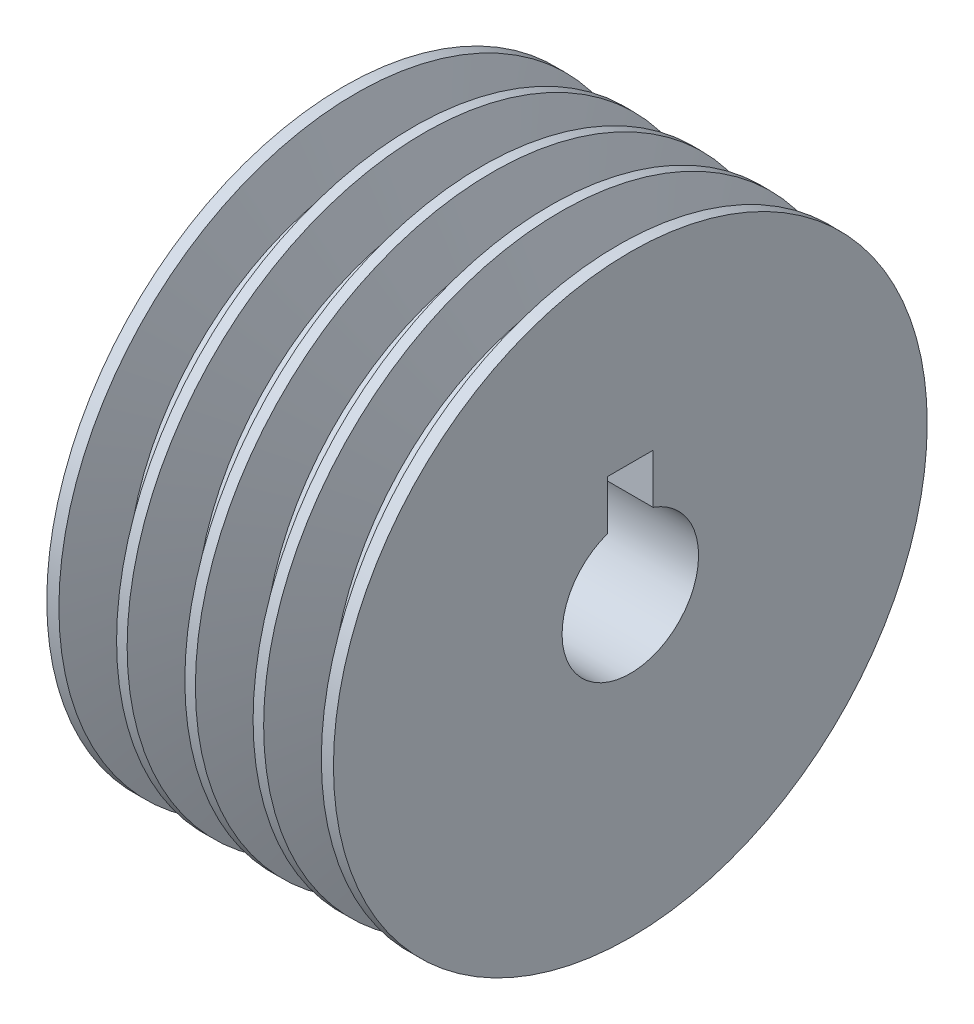
ISO-10303-21;
HEADER;
FILE_DESCRIPTION(('STEP AP214'),'2;1');
FILE_NAME('part.step','',(''),(''),'','','');
FILE_SCHEMA(('AUTOMOTIVE_DESIGN { 1 0 10303 214 1 1 1 1 }'));
ENDSEC;
DATA;
#1=APPLICATION_CONTEXT('core data for automotive mechanical design processes');
#2=APPLICATION_PROTOCOL_DEFINITION('international standard','automotive_design',2000,#1);
#3=PRODUCT_CONTEXT('',#1,'mechanical');
#4=PRODUCT('Part','Part','',(#3));
#5=PRODUCT_RELATED_PRODUCT_CATEGORY('part','',(#4));
#6=PRODUCT_DEFINITION_FORMATION('','',#4);
#7=PRODUCT_DEFINITION_CONTEXT('part definition',#1,'design');
#8=PRODUCT_DEFINITION('design','',#6,#7);
#9=PRODUCT_DEFINITION_SHAPE('','',#8);
#10=(LENGTH_UNIT() NAMED_UNIT(*) SI_UNIT(.MILLI.,.METRE.));
#11=(NAMED_UNIT(*) PLANE_ANGLE_UNIT() SI_UNIT($,.RADIAN.));
#12=(NAMED_UNIT(*) SI_UNIT($,.STERADIAN.) SOLID_ANGLE_UNIT());
#13=UNCERTAINTY_MEASURE_WITH_UNIT(LENGTH_MEASURE(1.E-05),#10,'distance_accuracy_value','');
#14=(GEOMETRIC_REPRESENTATION_CONTEXT(3) GLOBAL_UNCERTAINTY_ASSIGNED_CONTEXT((#13)) GLOBAL_UNIT_ASSIGNED_CONTEXT((#10,
#11,#12)) REPRESENTATION_CONTEXT('',''));
#15=CARTESIAN_POINT('',(0.,0.,0.));
#16=DIRECTION('',(0.,0.,1.));
#17=DIRECTION('',(1.,0.,0.));
#18=AXIS2_PLACEMENT_3D('',#15,#16,#17);
#19=CARTESIAN_POINT('',(31.5,0.,0.));
#20=DIRECTION('',(-1.,0.,0.));
#21=DIRECTION('',(0.,0.,1.));
#22=AXIS2_PLACEMENT_3D('',#19,#20,#21);
#23=CYLINDRICAL_SURFACE('',#22,65.25);
#24=CARTESIAN_POINT('',(13.8407593740113,0.,0.));
#25=DIRECTION('',(-1.,0.,0.));
#26=DIRECTION('',(0.,0.,1.));
#27=AXIS2_PLACEMENT_3D('',#24,#25,#26);
#28=CIRCLE('',#27,65.25);
#29=CARTESIAN_POINT('',(13.8407593740113,0.,65.25));
#30=VERTEX_POINT('',#29);
#31=EDGE_CURVE('E236',#30,#30,#28,.T.);
#32=ORIENTED_EDGE('',*,*,#31,.F.);
#33=EDGE_LOOP('',(#32));
#34=FACE_BOUND('',#33,.T.);
#35=CARTESIAN_POINT('',(16.1592406259887,0.,0.));
#36=DIRECTION('',(-1.,0.,0.));
#37=DIRECTION('',(0.,0.,1.));
#38=AXIS2_PLACEMENT_3D('',#35,#36,#37);
#39=CIRCLE('',#38,65.25);
#40=CARTESIAN_POINT('',(16.1592406259887,0.,65.25));
#41=VERTEX_POINT('',#40);
#42=EDGE_CURVE('E230',#41,#41,#39,.T.);
#43=ORIENTED_EDGE('',*,*,#42,.T.);
#44=EDGE_LOOP('',(#43));
#45=FACE_BOUND('',#44,.T.);
#46=ADVANCED_FACE('F34',(#34,#45),#23,.T.);
#47=CARTESIAN_POINT('',(31.5,0.,0.));
#48=DIRECTION('',(1.,0.,0.));
#49=DIRECTION('',(0.,0.,-1.));
#50=AXIS2_PLACEMENT_3D('',#47,#48,#49);
#51=CIRCLE('',#50,65.25);
#52=CARTESIAN_POINT('',(31.5,0.,-65.25));
#53=VERTEX_POINT('',#52);
#54=EDGE_CURVE('E11',#53,#53,#51,.T.);
#55=ORIENTED_EDGE('',*,*,#54,.F.);
#56=EDGE_LOOP('',(#55));
#57=FACE_BOUND('',#56,.T.);
#58=CARTESIAN_POINT('',(28.8407593740113,0.,0.));
#59=DIRECTION('',(-1.,0.,0.));
#60=DIRECTION('',(0.,0.,1.));
#61=AXIS2_PLACEMENT_3D('',#58,#59,#60);
#62=CIRCLE('',#61,65.25);
#63=CARTESIAN_POINT('',(28.8407593740113,0.,65.25));
#64=VERTEX_POINT('',#63);
#65=EDGE_CURVE('E221',#64,#64,#62,.T.);
#66=ORIENTED_EDGE('',*,*,#65,.F.);
#67=EDGE_LOOP('',(#66));
#68=FACE_BOUND('',#67,.T.);
#69=ADVANCED_FACE('F130',(#57,#68),#23,.T.);
#70=CARTESIAN_POINT('',(-1.15924062598866,0.,0.));
#71=DIRECTION('',(-1.,0.,0.));
#72=DIRECTION('',(0.,0.,1.));
#73=AXIS2_PLACEMENT_3D('',#70,#71,#72);
#74=CIRCLE('',#73,65.25);
#75=CARTESIAN_POINT('',(-1.15924062598866,0.,65.25));
#76=VERTEX_POINT('',#75);
#77=EDGE_CURVE('E248',#76,#76,#74,.T.);
#78=ORIENTED_EDGE('',*,*,#77,.F.);
#79=EDGE_LOOP('',(#78));
#80=FACE_BOUND('',#79,.T.);
#81=CARTESIAN_POINT('',(1.15924062598871,0.,0.));
#82=DIRECTION('',(-1.,0.,0.));
#83=DIRECTION('',(0.,0.,1.));
#84=AXIS2_PLACEMENT_3D('',#81,#82,#83);
#85=CIRCLE('',#84,65.25);
#86=CARTESIAN_POINT('',(1.15924062598871,0.,65.25));
#87=VERTEX_POINT('',#86);
#88=EDGE_CURVE('E228',#87,#87,#85,.T.);
#89=ORIENTED_EDGE('',*,*,#88,.T.);
#90=EDGE_LOOP('',(#89));
#91=FACE_BOUND('',#90,.T.);
#92=ADVANCED_FACE('F135',(#80,#91),#23,.T.);
#93=CARTESIAN_POINT('',(-16.1592406259887,0.,0.));
#94=DIRECTION('',(-1.,0.,0.));
#95=DIRECTION('',(0.,0.,1.));
#96=AXIS2_PLACEMENT_3D('',#93,#94,#95);
#97=CIRCLE('',#96,65.25);
#98=CARTESIAN_POINT('',(-16.1592406259887,0.,65.25));
#99=VERTEX_POINT('',#98);
#100=EDGE_CURVE('E156',#99,#99,#97,.T.);
#101=ORIENTED_EDGE('',*,*,#100,.F.);
#102=EDGE_LOOP('',(#101));
#103=FACE_BOUND('',#102,.T.);
#104=CARTESIAN_POINT('',(-13.8407593740113,0.,0.));
#105=DIRECTION('',(-1.,0.,0.));
#106=DIRECTION('',(0.,0.,1.));
#107=AXIS2_PLACEMENT_3D('',#104,#105,#106);
#108=CIRCLE('',#107,65.25);
#109=CARTESIAN_POINT('',(-13.8407593740113,0.,65.25));
#110=VERTEX_POINT('',#109);
#111=EDGE_CURVE('E245',#110,#110,#108,.T.);
#112=ORIENTED_EDGE('',*,*,#111,.T.);
#113=EDGE_LOOP('',(#112));
#114=FACE_BOUND('',#113,.T.);
#115=ADVANCED_FACE('F140',(#103,#114),#23,.T.);
#116=CARTESIAN_POINT('',(-31.5,0.,0.));
#117=DIRECTION('',(1.,0.,0.));
#118=DIRECTION('',(0.,0.,-1.));
#119=AXIS2_PLACEMENT_3D('',#116,#117,#118);
#120=CIRCLE('',#119,65.25);
#121=CARTESIAN_POINT('',(-31.5,0.,-65.25));
#122=VERTEX_POINT('',#121);
#123=EDGE_CURVE('E38',#122,#122,#120,.T.);
#124=ORIENTED_EDGE('',*,*,#123,.T.);
#125=EDGE_LOOP('',(#124));
#126=FACE_BOUND('',#125,.T.);
#127=CARTESIAN_POINT('',(-28.8407593740113,0.,0.));
#128=DIRECTION('',(-1.,0.,0.));
#129=DIRECTION('',(0.,0.,1.));
#130=AXIS2_PLACEMENT_3D('',#127,#128,#129);
#131=CIRCLE('',#130,65.25);
#132=CARTESIAN_POINT('',(-28.8407593740113,0.,65.25));
#133=VERTEX_POINT('',#132);
#134=EDGE_CURVE('E154',#133,#133,#131,.T.);
#135=ORIENTED_EDGE('',*,*,#134,.T.);
#136=EDGE_LOOP('',(#135));
#137=FACE_BOUND('',#136,.T.);
#138=ADVANCED_FACE('F36',(#126,#137),#23,.T.);
#139=CARTESIAN_POINT('',(31.5,0.,0.));
#140=DIRECTION('',(1.,0.,0.));
#141=DIRECTION('',(0.,0.,-1.));
#142=AXIS2_PLACEMENT_3D('',#139,#140,#141);
#143=PLANE('',#142);
#144=ORIENTED_EDGE('',*,*,#54,.T.);
#145=EDGE_LOOP('',(#144));
#146=FACE_BOUND('',#145,.T.);
#147=DIRECTION('',(0.,0.,1.));
#148=VECTOR('',#147,1.);
#149=CARTESIAN_POINT('',(31.5,25.,5.));
#150=LINE('',#149,#148);
#151=CARTESIAN_POINT('',(31.5,25.,-5.));
#152=VERTEX_POINT('',#151);
#153=CARTESIAN_POINT('',(31.5,25.,5.));
#154=VERTEX_POINT('',#153);
#155=EDGE_CURVE('E83',#152,#154,#150,.T.);
#156=ORIENTED_EDGE('',*,*,#155,.F.);
#157=DIRECTION('',(0.,1.,0.));
#158=VECTOR('',#157,1.);
#159=CARTESIAN_POINT('',(31.5,14.142135623731,-5.));
#160=LINE('',#159,#158);
#161=CARTESIAN_POINT('',(31.5,14.1421356237309,-5.));
#162=VERTEX_POINT('',#161);
#163=EDGE_CURVE('E75',#162,#152,#160,.T.);
#164=ORIENTED_EDGE('',*,*,#163,.F.);
#165=CARTESIAN_POINT('',(31.5,0.,0.));
#166=DIRECTION('',(1.,0.,0.));
#167=DIRECTION('',(0.,0.,-1.));
#168=AXIS2_PLACEMENT_3D('',#165,#166,#167);
#169=CIRCLE('',#168,15.);
#170=CARTESIAN_POINT('',(31.5,14.1421356237309,5.));
#171=VERTEX_POINT('',#170);
#172=EDGE_CURVE('E97',#171,#162,#169,.T.);
#173=ORIENTED_EDGE('',*,*,#172,.F.);
#174=DIRECTION('',(0.,-1.,0.));
#175=VECTOR('',#174,1.);
#176=CARTESIAN_POINT('',(31.5,14.1421356237309,5.));
#177=LINE('',#176,#175);
#178=EDGE_CURVE('E95',#154,#171,#177,.T.);
#179=ORIENTED_EDGE('',*,*,#178,.F.);
#180=EDGE_LOOP('',(#156,#164,#173,#179));
#181=FACE_BOUND('',#180,.T.);
#182=ADVANCED_FACE('F94',(#146,#181),#143,.T.);
#183=CARTESIAN_POINT('',(-31.5,0.,0.));
#184=DIRECTION('',(1.,0.,0.));
#185=DIRECTION('',(0.,0.,-1.));
#186=AXIS2_PLACEMENT_3D('',#183,#184,#185);
#187=PLANE('',#186);
#188=ORIENTED_EDGE('',*,*,#123,.F.);
#189=EDGE_LOOP('',(#188));
#190=FACE_BOUND('',#189,.T.);
#191=DIRECTION('',(0.,1.,0.));
#192=VECTOR('',#191,1.);
#193=CARTESIAN_POINT('',(-31.5,14.142135623731,-5.));
#194=LINE('',#193,#192);
#195=CARTESIAN_POINT('',(-31.5,14.142135623731,-5.));
#196=VERTEX_POINT('',#195);
#197=CARTESIAN_POINT('',(-31.5,25.,-5.));
#198=VERTEX_POINT('',#197);
#199=EDGE_CURVE('E57',#196,#198,#194,.T.);
#200=ORIENTED_EDGE('',*,*,#199,.T.);
#201=DIRECTION('',(0.,0.,1.));
#202=VECTOR('',#201,1.);
#203=CARTESIAN_POINT('',(-31.5,25.,5.));
#204=LINE('',#203,#202);
#205=CARTESIAN_POINT('',(-31.5,25.,5.));
#206=VERTEX_POINT('',#205);
#207=EDGE_CURVE('E90',#198,#206,#204,.T.);
#208=ORIENTED_EDGE('',*,*,#207,.T.);
#209=DIRECTION('',(0.,-1.,0.));
#210=VECTOR('',#209,1.);
#211=CARTESIAN_POINT('',(-31.5,14.1421356237309,5.));
#212=LINE('',#211,#210);
#213=CARTESIAN_POINT('',(-31.5,14.1421356237309,5.));
#214=VERTEX_POINT('',#213);
#215=EDGE_CURVE('E105',#206,#214,#212,.T.);
#216=ORIENTED_EDGE('',*,*,#215,.T.);
#217=CARTESIAN_POINT('',(-31.5,0.,0.));
#218=DIRECTION('',(1.,0.,0.));
#219=DIRECTION('',(0.,0.,-1.));
#220=AXIS2_PLACEMENT_3D('',#217,#218,#219);
#221=CIRCLE('',#220,15.);
#222=EDGE_CURVE('E84',#214,#196,#221,.T.);
#223=ORIENTED_EDGE('',*,*,#222,.T.);
#224=EDGE_LOOP('',(#200,#208,#216,#223));
#225=FACE_BOUND('',#224,.T.);
#226=ADVANCED_FACE('F116',(#190,#225),#187,.F.);
#227=CARTESIAN_POINT('',(31.5,14.142135623731,-5.));
#228=DIRECTION('',(0.,0.,1.));
#229=DIRECTION('',(0.,-1.,0.));
#230=AXIS2_PLACEMENT_3D('',#227,#228,#229);
#231=PLANE('',#230);
#232=ORIENTED_EDGE('',*,*,#199,.F.);
#233=DIRECTION('',(-1.,0.,0.));
#234=VECTOR('',#233,1.);
#235=CARTESIAN_POINT('',(31.5,14.1421356237309,-5.));
#236=LINE('',#235,#234);
#237=EDGE_CURVE('E79',#162,#196,#236,.T.);
#238=ORIENTED_EDGE('',*,*,#237,.F.);
#239=ORIENTED_EDGE('',*,*,#163,.T.);
#240=DIRECTION('',(-1.,0.,0.));
#241=VECTOR('',#240,1.);
#242=CARTESIAN_POINT('',(31.5,25.,-5.));
#243=LINE('',#242,#241);
#244=EDGE_CURVE('E78',#152,#198,#243,.T.);
#245=ORIENTED_EDGE('',*,*,#244,.T.);
#246=EDGE_LOOP('',(#232,#238,#239,#245));
#247=FACE_BOUND('',#246,.T.);
#248=ADVANCED_FACE('F77',(#247),#231,.T.);
#249=CARTESIAN_POINT('',(31.5,25.,5.));
#250=DIRECTION('',(0.,-1.,0.));
#251=DIRECTION('',(0.,0.,-1.));
#252=AXIS2_PLACEMENT_3D('',#249,#250,#251);
#253=PLANE('',#252);
#254=ORIENTED_EDGE('',*,*,#207,.F.);
#255=ORIENTED_EDGE('',*,*,#244,.F.);
#256=ORIENTED_EDGE('',*,*,#155,.T.);
#257=DIRECTION('',(-1.,0.,0.));
#258=VECTOR('',#257,1.);
#259=CARTESIAN_POINT('',(31.5,25.,5.));
#260=LINE('',#259,#258);
#261=EDGE_CURVE('E91',#154,#206,#260,.T.);
#262=ORIENTED_EDGE('',*,*,#261,.T.);
#263=EDGE_LOOP('',(#254,#255,#256,#262));
#264=FACE_BOUND('',#263,.T.);
#265=ADVANCED_FACE('F87',(#264),#253,.T.);
#266=CARTESIAN_POINT('',(31.5,14.1421356237309,5.));
#267=DIRECTION('',(0.,0.,-1.));
#268=DIRECTION('',(0.,1.,0.));
#269=AXIS2_PLACEMENT_3D('',#266,#267,#268);
#270=PLANE('',#269);
#271=ORIENTED_EDGE('',*,*,#215,.F.);
#272=ORIENTED_EDGE('',*,*,#261,.F.);
#273=ORIENTED_EDGE('',*,*,#178,.T.);
#274=DIRECTION('',(-1.,0.,0.));
#275=VECTOR('',#274,1.);
#276=CARTESIAN_POINT('',(31.5,14.1421356237309,5.));
#277=LINE('',#276,#275);
#278=EDGE_CURVE('E49',#171,#214,#277,.T.);
#279=ORIENTED_EDGE('',*,*,#278,.T.);
#280=EDGE_LOOP('',(#271,#272,#273,#279));
#281=FACE_BOUND('',#280,.T.);
#282=ADVANCED_FACE('F114',(#281),#270,.T.);
#283=CARTESIAN_POINT('',(31.5,0.,0.));
#284=DIRECTION('',(-1.,0.,0.));
#285=DIRECTION('',(0.,0.,1.));
#286=AXIS2_PLACEMENT_3D('',#283,#284,#285);
#287=CYLINDRICAL_SURFACE('',#286,15.);
#288=ORIENTED_EDGE('',*,*,#222,.F.);
#289=ORIENTED_EDGE('',*,*,#278,.F.);
#290=ORIENTED_EDGE('',*,*,#172,.T.);
#291=ORIENTED_EDGE('',*,*,#237,.T.);
#292=EDGE_LOOP('',(#288,#289,#290,#291));
#293=FACE_BOUND('',#292,.T.);
#294=ADVANCED_FACE('F117',(#293),#287,.F.);
#295=CARTESIAN_POINT('',(-28.8407593740113,0.,0.));
#296=DIRECTION('',(-1.,0.,0.));
#297=DIRECTION('',(0.,0.,1.));
#298=AXIS2_PLACEMENT_3D('',#295,#296,#297);
#299=CONICAL_SURFACE('',#298,65.25,1.27409035395586);
#300=CARTESIAN_POINT('',(-25.3401430713097,0.,0.));
#301=DIRECTION('',(-1.,0.,0.));
#302=DIRECTION('',(0.,0.,1.));
#303=AXIS2_PLACEMENT_3D('',#300,#301,#302);
#304=CIRCLE('',#303,53.8);
#305=CARTESIAN_POINT('',(-25.3401430713097,0.,53.8));
#306=VERTEX_POINT('',#305);
#307=EDGE_CURVE('E103',#306,#306,#304,.T.);
#308=ORIENTED_EDGE('',*,*,#307,.T.);
#309=EDGE_LOOP('',(#308));
#310=FACE_BOUND('',#309,.T.);
#311=ORIENTED_EDGE('',*,*,#134,.F.);
#312=EDGE_LOOP('',(#311));
#313=FACE_BOUND('',#312,.T.);
#314=ADVANCED_FACE('F119',(#310,#313),#299,.T.);
#315=CARTESIAN_POINT('',(0.,0.,0.));
#316=DIRECTION('',(-1.,0.,0.));
#317=DIRECTION('',(0.,0.,1.));
#318=AXIS2_PLACEMENT_3D('',#315,#316,#317);
#319=CYLINDRICAL_SURFACE('',#318,53.8);
#320=CARTESIAN_POINT('',(-19.6598569286903,0.,0.));
#321=DIRECTION('',(-1.,0.,0.));
#322=DIRECTION('',(0.,0.,1.));
#323=AXIS2_PLACEMENT_3D('',#320,#321,#322);
#324=CIRCLE('',#323,53.8);
#325=CARTESIAN_POINT('',(-19.6598569286903,0.,53.8));
#326=VERTEX_POINT('',#325);
#327=EDGE_CURVE('E160',#326,#326,#324,.T.);
#328=ORIENTED_EDGE('',*,*,#327,.T.);
#329=EDGE_LOOP('',(#328));
#330=FACE_BOUND('',#329,.T.);
#331=ORIENTED_EDGE('',*,*,#307,.F.);
#332=EDGE_LOOP('',(#331));
#333=FACE_BOUND('',#332,.T.);
#334=ADVANCED_FACE('F125',(#330,#333),#319,.T.);
#335=CARTESIAN_POINT('',(-19.6598569286903,0.,0.));
#336=DIRECTION('',(1.,0.,0.));
#337=DIRECTION('',(0.,0.,-1.));
#338=AXIS2_PLACEMENT_3D('',#335,#336,#337);
#339=CONICAL_SURFACE('',#338,53.8,1.27409035395586);
#340=ORIENTED_EDGE('',*,*,#100,.T.);
#341=EDGE_LOOP('',(#340));
#342=FACE_BOUND('',#341,.T.);
#343=ORIENTED_EDGE('',*,*,#327,.F.);
#344=EDGE_LOOP('',(#343));
#345=FACE_BOUND('',#344,.T.);
#346=ADVANCED_FACE('F172',(#342,#345),#339,.T.);
#347=CARTESIAN_POINT('',(-13.8407593740113,0.,0.));
#348=DIRECTION('',(-1.,0.,0.));
#349=DIRECTION('',(0.,0.,1.));
#350=AXIS2_PLACEMENT_3D('',#347,#348,#349);
#351=CONICAL_SURFACE('',#350,65.25,1.27409035395586);
#352=CARTESIAN_POINT('',(-10.3401430713097,0.,0.));
#353=DIRECTION('',(-1.,0.,0.));
#354=DIRECTION('',(0.,0.,1.));
#355=AXIS2_PLACEMENT_3D('',#352,#353,#354);
#356=CIRCLE('',#355,53.8);
#357=CARTESIAN_POINT('',(-10.3401430713097,0.,53.8));
#358=VERTEX_POINT('',#357);
#359=EDGE_CURVE('E157',#358,#358,#356,.T.);
#360=ORIENTED_EDGE('',*,*,#359,.T.);
#361=EDGE_LOOP('',(#360));
#362=FACE_BOUND('',#361,.T.);
#363=ORIENTED_EDGE('',*,*,#111,.F.);
#364=EDGE_LOOP('',(#363));
#365=FACE_BOUND('',#364,.T.);
#366=ADVANCED_FACE('F178',(#362,#365),#351,.T.);
#367=CARTESIAN_POINT('',(15.,0.,0.));
#368=DIRECTION('',(-1.,0.,0.));
#369=DIRECTION('',(0.,0.,1.));
#370=AXIS2_PLACEMENT_3D('',#367,#368,#369);
#371=CYLINDRICAL_SURFACE('',#370,53.8);
#372=CARTESIAN_POINT('',(-4.65985692869029,0.,0.));
#373=DIRECTION('',(-1.,0.,0.));
#374=DIRECTION('',(0.,0.,1.));
#375=AXIS2_PLACEMENT_3D('',#372,#373,#374);
#376=CIRCLE('',#375,53.8);
#377=CARTESIAN_POINT('',(-4.65985692869029,0.,53.8));
#378=VERTEX_POINT('',#377);
#379=EDGE_CURVE('E163',#378,#378,#376,.T.);
#380=ORIENTED_EDGE('',*,*,#379,.T.);
#381=EDGE_LOOP('',(#380));
#382=FACE_BOUND('',#381,.T.);
#383=ORIENTED_EDGE('',*,*,#359,.F.);
#384=EDGE_LOOP('',(#383));
#385=FACE_BOUND('',#384,.T.);
#386=ADVANCED_FACE('F184',(#382,#385),#371,.T.);
#387=CARTESIAN_POINT('',(-4.65985692869029,0.,0.));
#388=DIRECTION('',(1.,0.,0.));
#389=DIRECTION('',(0.,0.,-1.));
#390=AXIS2_PLACEMENT_3D('',#387,#388,#389);
#391=CONICAL_SURFACE('',#390,53.8,1.27409035395586);
#392=ORIENTED_EDGE('',*,*,#77,.T.);
#393=EDGE_LOOP('',(#392));
#394=FACE_BOUND('',#393,.T.);
#395=ORIENTED_EDGE('',*,*,#379,.F.);
#396=EDGE_LOOP('',(#395));
#397=FACE_BOUND('',#396,.T.);
#398=ADVANCED_FACE('F188',(#394,#397),#391,.T.);
#399=CARTESIAN_POINT('',(1.15924062598871,0.,0.));
#400=DIRECTION('',(-1.,0.,0.));
#401=DIRECTION('',(0.,0.,1.));
#402=AXIS2_PLACEMENT_3D('',#399,#400,#401);
#403=CONICAL_SURFACE('',#402,65.25,1.27409035395586);
#404=CARTESIAN_POINT('',(4.65985692869033,0.,0.));
#405=DIRECTION('',(-1.,0.,0.));
#406=DIRECTION('',(0.,0.,1.));
#407=AXIS2_PLACEMENT_3D('',#404,#405,#406);
#408=CIRCLE('',#407,53.8);
#409=CARTESIAN_POINT('',(4.65985692869033,0.,53.8));
#410=VERTEX_POINT('',#409);
#411=EDGE_CURVE('E242',#410,#410,#408,.T.);
#412=ORIENTED_EDGE('',*,*,#411,.T.);
#413=EDGE_LOOP('',(#412));
#414=FACE_BOUND('',#413,.T.);
#415=ORIENTED_EDGE('',*,*,#88,.F.);
#416=EDGE_LOOP('',(#415));
#417=FACE_BOUND('',#416,.T.);
#418=ADVANCED_FACE('F192',(#414,#417),#403,.T.);
#419=CARTESIAN_POINT('',(30.,0.,0.));
#420=DIRECTION('',(-1.,0.,0.));
#421=DIRECTION('',(0.,0.,1.));
#422=AXIS2_PLACEMENT_3D('',#419,#420,#421);
#423=CYLINDRICAL_SURFACE('',#422,53.8);
#424=CARTESIAN_POINT('',(10.3401430713097,0.,0.));
#425=DIRECTION('',(-1.,0.,0.));
#426=DIRECTION('',(0.,0.,1.));
#427=AXIS2_PLACEMENT_3D('',#424,#425,#426);
#428=CIRCLE('',#427,53.8);
#429=CARTESIAN_POINT('',(10.3401430713097,0.,53.8));
#430=VERTEX_POINT('',#429);
#431=EDGE_CURVE('E239',#430,#430,#428,.T.);
#432=ORIENTED_EDGE('',*,*,#431,.T.);
#433=EDGE_LOOP('',(#432));
#434=FACE_BOUND('',#433,.T.);
#435=ORIENTED_EDGE('',*,*,#411,.F.);
#436=EDGE_LOOP('',(#435));
#437=FACE_BOUND('',#436,.T.);
#438=ADVANCED_FACE('F196',(#434,#437),#423,.T.);
#439=CARTESIAN_POINT('',(10.3401430713097,0.,0.));
#440=DIRECTION('',(1.,0.,0.));
#441=DIRECTION('',(0.,0.,-1.));
#442=AXIS2_PLACEMENT_3D('',#439,#440,#441);
#443=CONICAL_SURFACE('',#442,53.8,1.27409035395586);
#444=ORIENTED_EDGE('',*,*,#31,.T.);
#445=EDGE_LOOP('',(#444));
#446=FACE_BOUND('',#445,.T.);
#447=ORIENTED_EDGE('',*,*,#431,.F.);
#448=EDGE_LOOP('',(#447));
#449=FACE_BOUND('',#448,.T.);
#450=ADVANCED_FACE('F200',(#446,#449),#443,.T.);
#451=CARTESIAN_POINT('',(16.1592406259887,0.,0.));
#452=DIRECTION('',(-1.,0.,0.));
#453=DIRECTION('',(0.,0.,1.));
#454=AXIS2_PLACEMENT_3D('',#451,#452,#453);
#455=CONICAL_SURFACE('',#454,65.25,1.27409035395586);
#456=CARTESIAN_POINT('',(19.6598569286903,0.,0.));
#457=DIRECTION('',(-1.,0.,0.));
#458=DIRECTION('',(0.,0.,1.));
#459=AXIS2_PLACEMENT_3D('',#456,#457,#458);
#460=CIRCLE('',#459,53.8);
#461=CARTESIAN_POINT('',(19.6598569286903,0.,53.8));
#462=VERTEX_POINT('',#461);
#463=EDGE_CURVE('E225',#462,#462,#460,.T.);
#464=ORIENTED_EDGE('',*,*,#463,.T.);
#465=EDGE_LOOP('',(#464));
#466=FACE_BOUND('',#465,.T.);
#467=ORIENTED_EDGE('',*,*,#42,.F.);
#468=EDGE_LOOP('',(#467));
#469=FACE_BOUND('',#468,.T.);
#470=ADVANCED_FACE('F204',(#466,#469),#455,.T.);
#471=CARTESIAN_POINT('',(45.,0.,0.));
#472=DIRECTION('',(-1.,0.,0.));
#473=DIRECTION('',(0.,0.,1.));
#474=AXIS2_PLACEMENT_3D('',#471,#472,#473);
#475=CYLINDRICAL_SURFACE('',#474,53.8);
#476=CARTESIAN_POINT('',(25.3401430713097,0.,0.));
#477=DIRECTION('',(-1.,0.,0.));
#478=DIRECTION('',(0.,0.,1.));
#479=AXIS2_PLACEMENT_3D('',#476,#477,#478);
#480=CIRCLE('',#479,53.8);
#481=CARTESIAN_POINT('',(25.3401430713097,0.,53.8));
#482=VERTEX_POINT('',#481);
#483=EDGE_CURVE('E224',#482,#482,#480,.T.);
#484=ORIENTED_EDGE('',*,*,#483,.T.);
#485=EDGE_LOOP('',(#484));
#486=FACE_BOUND('',#485,.T.);
#487=ORIENTED_EDGE('',*,*,#463,.F.);
#488=EDGE_LOOP('',(#487));
#489=FACE_BOUND('',#488,.T.);
#490=ADVANCED_FACE('F208',(#486,#489),#475,.T.);
#491=CARTESIAN_POINT('',(25.3401430713097,0.,0.));
#492=DIRECTION('',(1.,0.,0.));
#493=DIRECTION('',(0.,0.,-1.));
#494=AXIS2_PLACEMENT_3D('',#491,#492,#493);
#495=CONICAL_SURFACE('',#494,53.8,1.27409035395586);
#496=ORIENTED_EDGE('',*,*,#65,.T.);
#497=EDGE_LOOP('',(#496));
#498=FACE_BOUND('',#497,.T.);
#499=ORIENTED_EDGE('',*,*,#483,.F.);
#500=EDGE_LOOP('',(#499));
#501=FACE_BOUND('',#500,.T.);
#502=ADVANCED_FACE('F212',(#498,#501),#495,.T.);
#503=CLOSED_SHELL('',(#46,#69,#92,#115,#138,#182,#226,#248,#265,#282,#294,#314,#334,#346,#366,
#386,#398,#418,#438,#450,#470,#490,#502));
#504=MANIFOLD_SOLID_BREP('B2',#503);
#505=ADVANCED_BREP_SHAPE_REPRESENTATION('',(#18,#504),#14);
#506=SHAPE_DEFINITION_REPRESENTATION(#9,#505);
ENDSEC;
END-ISO-10303-21;
